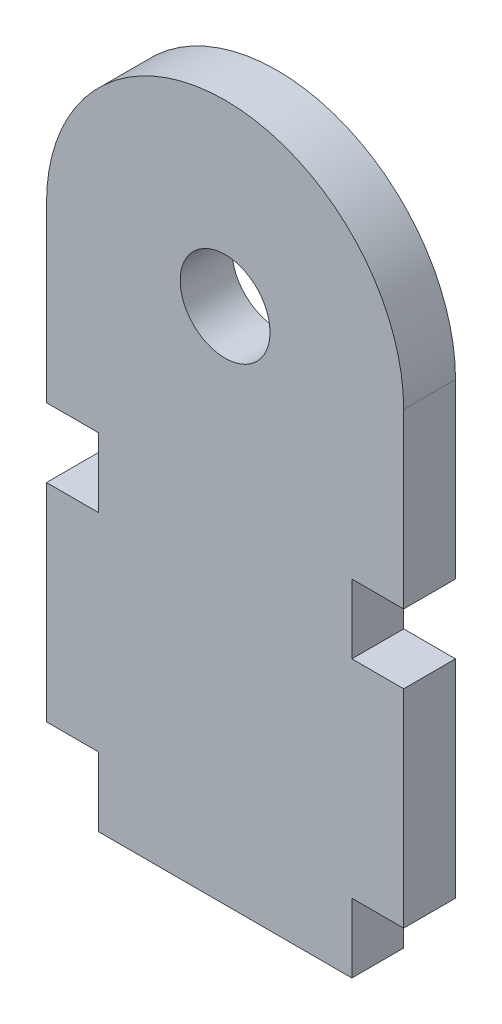
ISO-10303-21;
HEADER;
FILE_DESCRIPTION(('STEP AP214'),'2;1');
FILE_NAME('part.step','',(''),(''),'','','');
FILE_SCHEMA(('AUTOMOTIVE_DESIGN { 1 0 10303 214 1 1 1 1 }'));
ENDSEC;
DATA;
#1=APPLICATION_CONTEXT('core data for automotive mechanical design processes');
#2=APPLICATION_PROTOCOL_DEFINITION('international standard','automotive_design',2000,#1);
#3=PRODUCT_CONTEXT('',#1,'mechanical');
#4=PRODUCT('Part','Part','',(#3));
#5=PRODUCT_RELATED_PRODUCT_CATEGORY('part','',(#4));
#6=PRODUCT_DEFINITION_FORMATION('','',#4);
#7=PRODUCT_DEFINITION_CONTEXT('part definition',#1,'design');
#8=PRODUCT_DEFINITION('design','',#6,#7);
#9=PRODUCT_DEFINITION_SHAPE('','',#8);
#10=(LENGTH_UNIT() NAMED_UNIT(*) SI_UNIT(.MILLI.,.METRE.));
#11=(NAMED_UNIT(*) PLANE_ANGLE_UNIT() SI_UNIT($,.RADIAN.));
#12=(NAMED_UNIT(*) SI_UNIT($,.STERADIAN.) SOLID_ANGLE_UNIT());
#13=UNCERTAINTY_MEASURE_WITH_UNIT(LENGTH_MEASURE(1.E-05),#10,'distance_accuracy_value','');
#14=(GEOMETRIC_REPRESENTATION_CONTEXT(3) GLOBAL_UNCERTAINTY_ASSIGNED_CONTEXT((#13)) GLOBAL_UNIT_ASSIGNED_CONTEXT((#10,
#11,#12)) REPRESENTATION_CONTEXT('',''));
#15=CARTESIAN_POINT('',(0.,0.,0.));
#16=DIRECTION('',(0.,0.,1.));
#17=DIRECTION('',(1.,0.,0.));
#18=AXIS2_PLACEMENT_3D('',#15,#16,#17);
#19=CARTESIAN_POINT('',(8.83499999999999,75.,15.));
#20=DIRECTION('',(0.,0.,1.));
#21=DIRECTION('',(1.,0.,0.));
#22=AXIS2_PLACEMENT_3D('',#19,#20,#21);
#23=PLANE('',#22);
#24=DIRECTION('',(0.,1.,0.));
#25=VECTOR('',#24,1.);
#26=CARTESIAN_POINT('',(60.53,-55.,15.));
#27=LINE('',#26,#25);
#28=CARTESIAN_POINT('',(60.53,-55.,15.));
#29=VERTEX_POINT('',#28);
#30=CARTESIAN_POINT('',(60.53,5.00000000000003,15.));
#31=VERTEX_POINT('',#30);
#32=EDGE_CURVE('E270',#29,#31,#27,.T.);
#33=ORIENTED_EDGE('',*,*,#32,.T.);
#34=DIRECTION('',(-1.,0.,0.));
#35=VECTOR('',#34,1.);
#36=CARTESIAN_POINT('',(60.53,5.00000000000003,15.));
#37=LINE('',#36,#35);
#38=CARTESIAN_POINT('',(45.53,5.00000000000003,15.));
#39=VERTEX_POINT('',#38);
#40=EDGE_CURVE('E162',#31,#39,#37,.T.);
#41=ORIENTED_EDGE('',*,*,#40,.T.);
#42=DIRECTION('',(0.,1.,0.));
#43=VECTOR('',#42,1.);
#44=CARTESIAN_POINT('',(45.53,5.00000000000003,15.));
#45=LINE('',#44,#43);
#46=CARTESIAN_POINT('',(45.53,25.,15.));
#47=VERTEX_POINT('',#46);
#48=EDGE_CURVE('E301',#39,#47,#45,.T.);
#49=ORIENTED_EDGE('',*,*,#48,.T.);
#50=DIRECTION('',(-1.,0.,0.));
#51=VECTOR('',#50,1.);
#52=CARTESIAN_POINT('',(60.53,25.,15.));
#53=LINE('',#52,#51);
#54=CARTESIAN_POINT('',(60.53,25.,15.));
#55=VERTEX_POINT('',#54);
#56=EDGE_CURVE('E313',#55,#47,#53,.T.);
#57=ORIENTED_EDGE('',*,*,#56,.F.);
#58=DIRECTION('',(0.,1.,0.));
#59=VECTOR('',#58,1.);
#60=CARTESIAN_POINT('',(60.53,25.,15.));
#61=LINE('',#60,#59);
#62=CARTESIAN_POINT('',(60.53,75.,15.));
#63=VERTEX_POINT('',#62);
#64=EDGE_CURVE('E314',#55,#63,#61,.T.);
#65=ORIENTED_EDGE('',*,*,#64,.T.);
#66=CARTESIAN_POINT('',(8.83499999999999,75.,15.));
#67=DIRECTION('',(0.,0.,1.));
#68=DIRECTION('',(1.,0.,0.));
#69=AXIS2_PLACEMENT_3D('',#66,#67,#68);
#70=CIRCLE('',#69,51.695);
#71=CARTESIAN_POINT('',(-42.86,75.,15.));
#72=VERTEX_POINT('',#71);
#73=EDGE_CURVE('E316',#63,#72,#70,.T.);
#74=ORIENTED_EDGE('',*,*,#73,.T.);
#75=DIRECTION('',(0.,1.,0.));
#76=VECTOR('',#75,1.);
#77=CARTESIAN_POINT('',(-42.86,25.,15.));
#78=LINE('',#77,#76);
#79=CARTESIAN_POINT('',(-42.86,25.,15.));
#80=VERTEX_POINT('',#79);
#81=EDGE_CURVE('E322',#80,#72,#78,.T.);
#82=ORIENTED_EDGE('',*,*,#81,.F.);
#83=DIRECTION('',(1.,0.,0.));
#84=VECTOR('',#83,1.);
#85=CARTESIAN_POINT('',(-42.86,25.,15.));
#86=LINE('',#85,#84);
#87=CARTESIAN_POINT('',(-27.86,25.,15.));
#88=VERTEX_POINT('',#87);
#89=EDGE_CURVE('E325',#80,#88,#86,.T.);
#90=ORIENTED_EDGE('',*,*,#89,.T.);
#91=DIRECTION('',(0.,1.,0.));
#92=VECTOR('',#91,1.);
#93=CARTESIAN_POINT('',(-27.86,5.00000000000001,15.));
#94=LINE('',#93,#92);
#95=CARTESIAN_POINT('',(-27.86,5.00000000000001,15.));
#96=VERTEX_POINT('',#95);
#97=EDGE_CURVE('E327',#96,#88,#94,.T.);
#98=ORIENTED_EDGE('',*,*,#97,.F.);
#99=DIRECTION('',(1.,0.,0.));
#100=VECTOR('',#99,1.);
#101=CARTESIAN_POINT('',(-42.86,5.00000000000002,15.));
#102=LINE('',#101,#100);
#103=CARTESIAN_POINT('',(-42.86,5.00000000000002,15.));
#104=VERTEX_POINT('',#103);
#105=EDGE_CURVE('E330',#104,#96,#102,.T.);
#106=ORIENTED_EDGE('',*,*,#105,.F.);
#107=DIRECTION('',(0.,1.,0.));
#108=VECTOR('',#107,1.);
#109=CARTESIAN_POINT('',(-42.86,-55.,15.));
#110=LINE('',#109,#108);
#111=CARTESIAN_POINT('',(-42.86,-55.,15.));
#112=VERTEX_POINT('',#111);
#113=EDGE_CURVE('E333',#112,#104,#110,.T.);
#114=ORIENTED_EDGE('',*,*,#113,.F.);
#115=DIRECTION('',(1.,0.,0.));
#116=VECTOR('',#115,1.);
#117=CARTESIAN_POINT('',(-42.86,-55.,15.));
#118=LINE('',#117,#116);
#119=CARTESIAN_POINT('',(-27.86,-55.,15.));
#120=VERTEX_POINT('',#119);
#121=EDGE_CURVE('E336',#112,#120,#118,.T.);
#122=ORIENTED_EDGE('',*,*,#121,.T.);
#123=DIRECTION('',(0.,-1.,0.));
#124=VECTOR('',#123,1.);
#125=CARTESIAN_POINT('',(-27.86,-55.,15.));
#126=LINE('',#125,#124);
#127=CARTESIAN_POINT('',(-27.86,-75.,15.));
#128=VERTEX_POINT('',#127);
#129=EDGE_CURVE('E209',#120,#128,#126,.T.);
#130=ORIENTED_EDGE('',*,*,#129,.T.);
#131=DIRECTION('',(1.,0.,0.));
#132=VECTOR('',#131,1.);
#133=CARTESIAN_POINT('',(-27.86,-75.,15.));
#134=LINE('',#133,#132);
#135=CARTESIAN_POINT('',(45.53,-75.,15.));
#136=VERTEX_POINT('',#135);
#137=EDGE_CURVE('E202',#128,#136,#134,.T.);
#138=ORIENTED_EDGE('',*,*,#137,.T.);
#139=DIRECTION('',(0.,-1.,0.));
#140=VECTOR('',#139,1.);
#141=CARTESIAN_POINT('',(45.53,-55.,15.));
#142=LINE('',#141,#140);
#143=CARTESIAN_POINT('',(45.53,-55.,15.));
#144=VERTEX_POINT('',#143);
#145=EDGE_CURVE('E207',#144,#136,#142,.T.);
#146=ORIENTED_EDGE('',*,*,#145,.F.);
#147=DIRECTION('',(-1.,0.,0.));
#148=VECTOR('',#147,1.);
#149=CARTESIAN_POINT('',(60.53,-55.,15.));
#150=LINE('',#149,#148);
#151=EDGE_CURVE('E224',#29,#144,#150,.T.);
#152=ORIENTED_EDGE('',*,*,#151,.F.);
#153=EDGE_LOOP('',(#33,#41,#49,#57,#65,#74,#82,#90,#98,#106,#114,#122,#130,#138,#146,#152));
#154=FACE_BOUND('',#153,.T.);
#155=CARTESIAN_POINT('',(8.83499999999999,75.,15.));
#156=DIRECTION('',(0.,0.,1.));
#157=DIRECTION('',(1.,0.,0.));
#158=AXIS2_PLACEMENT_3D('',#155,#156,#157);
#159=CIRCLE('',#158,13.);
#160=CARTESIAN_POINT('',(21.835,75.,15.));
#161=VERTEX_POINT('',#160);
#162=EDGE_CURVE('E232',#161,#161,#159,.T.);
#163=ORIENTED_EDGE('',*,*,#162,.F.);
#164=EDGE_LOOP('',(#163));
#165=FACE_BOUND('',#164,.T.);
#166=ADVANCED_FACE('F83',(#154,#165),#23,.T.);
#167=CARTESIAN_POINT('',(8.83499999999999,75.,0.));
#168=DIRECTION('',(0.,0.,1.));
#169=DIRECTION('',(1.,0.,0.));
#170=AXIS2_PLACEMENT_3D('',#167,#168,#169);
#171=PLANE('',#170);
#172=DIRECTION('',(0.,1.,0.));
#173=VECTOR('',#172,1.);
#174=CARTESIAN_POINT('',(60.53,-55.,0.));
#175=LINE('',#174,#173);
#176=CARTESIAN_POINT('',(60.53,-55.,0.));
#177=VERTEX_POINT('',#176);
#178=CARTESIAN_POINT('',(60.53,5.00000000000003,0.));
#179=VERTEX_POINT('',#178);
#180=EDGE_CURVE('E229',#177,#179,#175,.T.);
#181=ORIENTED_EDGE('',*,*,#180,.F.);
#182=DIRECTION('',(-1.,0.,0.));
#183=VECTOR('',#182,1.);
#184=CARTESIAN_POINT('',(60.53,-55.,0.));
#185=LINE('',#184,#183);
#186=CARTESIAN_POINT('',(45.53,-55.,0.));
#187=VERTEX_POINT('',#186);
#188=EDGE_CURVE('E267',#177,#187,#185,.T.);
#189=ORIENTED_EDGE('',*,*,#188,.T.);
#190=DIRECTION('',(0.,-1.,0.));
#191=VECTOR('',#190,1.);
#192=CARTESIAN_POINT('',(45.53,-55.,0.));
#193=LINE('',#192,#191);
#194=CARTESIAN_POINT('',(45.53,-75.,0.));
#195=VERTEX_POINT('',#194);
#196=EDGE_CURVE('E265',#187,#195,#193,.T.);
#197=ORIENTED_EDGE('',*,*,#196,.T.);
#198=DIRECTION('',(1.,0.,0.));
#199=VECTOR('',#198,1.);
#200=CARTESIAN_POINT('',(-27.86,-75.,0.));
#201=LINE('',#200,#199);
#202=CARTESIAN_POINT('',(-27.86,-75.,0.));
#203=VERTEX_POINT('',#202);
#204=EDGE_CURVE('E218',#203,#195,#201,.T.);
#205=ORIENTED_EDGE('',*,*,#204,.F.);
#206=DIRECTION('',(0.,-1.,0.));
#207=VECTOR('',#206,1.);
#208=CARTESIAN_POINT('',(-27.86,-55.,0.));
#209=LINE('',#208,#207);
#210=CARTESIAN_POINT('',(-27.86,-55.,0.));
#211=VERTEX_POINT('',#210);
#212=EDGE_CURVE('E262',#211,#203,#209,.T.);
#213=ORIENTED_EDGE('',*,*,#212,.F.);
#214=DIRECTION('',(1.,0.,0.));
#215=VECTOR('',#214,1.);
#216=CARTESIAN_POINT('',(-42.86,-55.,0.));
#217=LINE('',#216,#215);
#218=CARTESIAN_POINT('',(-42.86,-55.,0.));
#219=VERTEX_POINT('',#218);
#220=EDGE_CURVE('E260',#219,#211,#217,.T.);
#221=ORIENTED_EDGE('',*,*,#220,.F.);
#222=DIRECTION('',(0.,1.,0.));
#223=VECTOR('',#222,1.);
#224=CARTESIAN_POINT('',(-42.86,-55.,0.));
#225=LINE('',#224,#223);
#226=CARTESIAN_POINT('',(-42.86,5.00000000000002,0.));
#227=VERTEX_POINT('',#226);
#228=EDGE_CURVE('E257',#219,#227,#225,.T.);
#229=ORIENTED_EDGE('',*,*,#228,.T.);
#230=DIRECTION('',(1.,0.,0.));
#231=VECTOR('',#230,1.);
#232=CARTESIAN_POINT('',(-42.86,5.00000000000002,0.));
#233=LINE('',#232,#231);
#234=CARTESIAN_POINT('',(-27.86,5.00000000000001,0.));
#235=VERTEX_POINT('',#234);
#236=EDGE_CURVE('E254',#227,#235,#233,.T.);
#237=ORIENTED_EDGE('',*,*,#236,.T.);
#238=DIRECTION('',(0.,1.,0.));
#239=VECTOR('',#238,1.);
#240=CARTESIAN_POINT('',(-27.86,5.00000000000001,0.));
#241=LINE('',#240,#239);
#242=CARTESIAN_POINT('',(-27.86,25.,0.));
#243=VERTEX_POINT('',#242);
#244=EDGE_CURVE('E251',#235,#243,#241,.T.);
#245=ORIENTED_EDGE('',*,*,#244,.T.);
#246=DIRECTION('',(1.,0.,0.));
#247=VECTOR('',#246,1.);
#248=CARTESIAN_POINT('',(-42.86,25.,0.));
#249=LINE('',#248,#247);
#250=CARTESIAN_POINT('',(-42.86,25.,0.));
#251=VERTEX_POINT('',#250);
#252=EDGE_CURVE('E248',#251,#243,#249,.T.);
#253=ORIENTED_EDGE('',*,*,#252,.F.);
#254=DIRECTION('',(0.,1.,0.));
#255=VECTOR('',#254,1.);
#256=CARTESIAN_POINT('',(-42.86,25.,0.));
#257=LINE('',#256,#255);
#258=CARTESIAN_POINT('',(-42.86,75.,0.));
#259=VERTEX_POINT('',#258);
#260=EDGE_CURVE('E245',#251,#259,#257,.T.);
#261=ORIENTED_EDGE('',*,*,#260,.T.);
#262=CARTESIAN_POINT('',(8.83499999999999,75.,0.));
#263=DIRECTION('',(0.,0.,1.));
#264=DIRECTION('',(1.,0.,0.));
#265=AXIS2_PLACEMENT_3D('',#262,#263,#264);
#266=CIRCLE('',#265,51.695);
#267=CARTESIAN_POINT('',(60.53,75.,0.));
#268=VERTEX_POINT('',#267);
#269=EDGE_CURVE('E242',#268,#259,#266,.T.);
#270=ORIENTED_EDGE('',*,*,#269,.F.);
#271=DIRECTION('',(0.,1.,0.));
#272=VECTOR('',#271,1.);
#273=CARTESIAN_POINT('',(60.53,25.,0.));
#274=LINE('',#273,#272);
#275=CARTESIAN_POINT('',(60.53,25.,0.));
#276=VERTEX_POINT('',#275);
#277=EDGE_CURVE('E240',#276,#268,#274,.T.);
#278=ORIENTED_EDGE('',*,*,#277,.F.);
#279=DIRECTION('',(-1.,0.,0.));
#280=VECTOR('',#279,1.);
#281=CARTESIAN_POINT('',(60.53,25.,0.));
#282=LINE('',#281,#280);
#283=CARTESIAN_POINT('',(45.53,25.,0.));
#284=VERTEX_POINT('',#283);
#285=EDGE_CURVE('E237',#276,#284,#282,.T.);
#286=ORIENTED_EDGE('',*,*,#285,.T.);
#287=DIRECTION('',(0.,1.,0.));
#288=VECTOR('',#287,1.);
#289=CARTESIAN_POINT('',(45.53,5.00000000000003,0.));
#290=LINE('',#289,#288);
#291=CARTESIAN_POINT('',(45.53,5.00000000000003,0.));
#292=VERTEX_POINT('',#291);
#293=EDGE_CURVE('E234',#292,#284,#290,.T.);
#294=ORIENTED_EDGE('',*,*,#293,.F.);
#295=DIRECTION('',(-1.,0.,0.));
#296=VECTOR('',#295,1.);
#297=CARTESIAN_POINT('',(60.53,5.00000000000003,0.));
#298=LINE('',#297,#296);
#299=EDGE_CURVE('E231',#179,#292,#298,.T.);
#300=ORIENTED_EDGE('',*,*,#299,.F.);
#301=EDGE_LOOP('',(#181,#189,#197,#205,#213,#221,#229,#237,#245,#253,#261,#270,#278,#286,#294,#300));
#302=FACE_BOUND('',#301,.T.);
#303=CARTESIAN_POINT('',(8.83499999999999,75.,0.));
#304=DIRECTION('',(0.,0.,1.));
#305=DIRECTION('',(1.,0.,0.));
#306=AXIS2_PLACEMENT_3D('',#303,#304,#305);
#307=CIRCLE('',#306,13.);
#308=CARTESIAN_POINT('',(21.835,75.,0.));
#309=VERTEX_POINT('',#308);
#310=EDGE_CURVE('E374',#309,#309,#307,.T.);
#311=ORIENTED_EDGE('',*,*,#310,.T.);
#312=EDGE_LOOP('',(#311));
#313=FACE_BOUND('',#312,.T.);
#314=ADVANCED_FACE('F303',(#302,#313),#171,.F.);
#315=CARTESIAN_POINT('',(60.53,-55.,15.));
#316=DIRECTION('',(-1.,0.,0.));
#317=DIRECTION('',(0.,-1.,0.));
#318=AXIS2_PLACEMENT_3D('',#315,#316,#317);
#319=PLANE('',#318);
#320=ORIENTED_EDGE('',*,*,#180,.T.);
#321=DIRECTION('',(0.,0.,-1.));
#322=VECTOR('',#321,1.);
#323=CARTESIAN_POINT('',(60.53,5.00000000000003,15.));
#324=LINE('',#323,#322);
#325=EDGE_CURVE('E12',#31,#179,#324,.T.);
#326=ORIENTED_EDGE('',*,*,#325,.F.);
#327=ORIENTED_EDGE('',*,*,#32,.F.);
#328=DIRECTION('',(0.,0.,-1.));
#329=VECTOR('',#328,1.);
#330=CARTESIAN_POINT('',(60.53,-55.,15.));
#331=LINE('',#330,#329);
#332=EDGE_CURVE('E100',#29,#177,#331,.T.);
#333=ORIENTED_EDGE('',*,*,#332,.T.);
#334=EDGE_LOOP('',(#320,#326,#327,#333));
#335=FACE_BOUND('',#334,.T.);
#336=ADVANCED_FACE('F85',(#335),#319,.F.);
#337=CARTESIAN_POINT('',(60.53,5.00000000000003,15.));
#338=DIRECTION('',(0.,-1.,0.));
#339=DIRECTION('',(0.,0.,-1.));
#340=AXIS2_PLACEMENT_3D('',#337,#338,#339);
#341=PLANE('',#340);
#342=ORIENTED_EDGE('',*,*,#299,.T.);
#343=DIRECTION('',(0.,0.,-1.));
#344=VECTOR('',#343,1.);
#345=CARTESIAN_POINT('',(45.53,5.00000000000003,15.));
#346=LINE('',#345,#344);
#347=EDGE_CURVE('E92',#39,#292,#346,.T.);
#348=ORIENTED_EDGE('',*,*,#347,.F.);
#349=ORIENTED_EDGE('',*,*,#40,.F.);
#350=ORIENTED_EDGE('',*,*,#325,.T.);
#351=EDGE_LOOP('',(#342,#348,#349,#350));
#352=FACE_BOUND('',#351,.T.);
#353=ADVANCED_FACE('F367',(#352),#341,.F.);
#354=CARTESIAN_POINT('',(45.53,5.00000000000003,15.));
#355=DIRECTION('',(-1.,0.,0.));
#356=DIRECTION('',(0.,-1.,0.));
#357=AXIS2_PLACEMENT_3D('',#354,#355,#356);
#358=PLANE('',#357);
#359=ORIENTED_EDGE('',*,*,#293,.T.);
#360=DIRECTION('',(0.,0.,-1.));
#361=VECTOR('',#360,1.);
#362=CARTESIAN_POINT('',(45.53,25.,15.));
#363=LINE('',#362,#361);
#364=EDGE_CURVE('E294',#47,#284,#363,.T.);
#365=ORIENTED_EDGE('',*,*,#364,.F.);
#366=ORIENTED_EDGE('',*,*,#48,.F.);
#367=ORIENTED_EDGE('',*,*,#347,.T.);
#368=EDGE_LOOP('',(#359,#365,#366,#367));
#369=FACE_BOUND('',#368,.T.);
#370=ADVANCED_FACE('F299',(#369),#358,.F.);
#371=CARTESIAN_POINT('',(60.53,25.,15.));
#372=DIRECTION('',(0.,-1.,0.));
#373=DIRECTION('',(1.,0.,0.));
#374=AXIS2_PLACEMENT_3D('',#371,#372,#373);
#375=PLANE('',#374);
#376=ORIENTED_EDGE('',*,*,#285,.F.);
#377=DIRECTION('',(0.,0.,-1.));
#378=VECTOR('',#377,1.);
#379=CARTESIAN_POINT('',(60.53,25.,15.));
#380=LINE('',#379,#378);
#381=EDGE_CURVE('E292',#55,#276,#380,.T.);
#382=ORIENTED_EDGE('',*,*,#381,.F.);
#383=ORIENTED_EDGE('',*,*,#56,.T.);
#384=ORIENTED_EDGE('',*,*,#364,.T.);
#385=EDGE_LOOP('',(#376,#382,#383,#384));
#386=FACE_BOUND('',#385,.T.);
#387=ADVANCED_FACE('F309',(#386),#375,.T.);
#388=CARTESIAN_POINT('',(60.53,25.,15.));
#389=DIRECTION('',(-1.,0.,0.));
#390=DIRECTION('',(0.,-1.,0.));
#391=AXIS2_PLACEMENT_3D('',#388,#389,#390);
#392=PLANE('',#391);
#393=ORIENTED_EDGE('',*,*,#277,.T.);
#394=DIRECTION('',(0.,0.,-1.));
#395=VECTOR('',#394,1.);
#396=CARTESIAN_POINT('',(60.53,75.,15.));
#397=LINE('',#396,#395);
#398=EDGE_CURVE('E289',#63,#268,#397,.T.);
#399=ORIENTED_EDGE('',*,*,#398,.F.);
#400=ORIENTED_EDGE('',*,*,#64,.F.);
#401=ORIENTED_EDGE('',*,*,#381,.T.);
#402=EDGE_LOOP('',(#393,#399,#400,#401));
#403=FACE_BOUND('',#402,.T.);
#404=ADVANCED_FACE('F388',(#403),#392,.F.);
#405=CARTESIAN_POINT('',(8.83499999999999,75.,15.));
#406=DIRECTION('',(0.,0.,-1.));
#407=DIRECTION('',(-1.,0.,0.));
#408=AXIS2_PLACEMENT_3D('',#405,#406,#407);
#409=CYLINDRICAL_SURFACE('',#408,51.695);
#410=ORIENTED_EDGE('',*,*,#269,.T.);
#411=DIRECTION('',(0.,0.,-1.));
#412=VECTOR('',#411,1.);
#413=CARTESIAN_POINT('',(-42.86,75.,15.));
#414=LINE('',#413,#412);
#415=EDGE_CURVE('E287',#72,#259,#414,.T.);
#416=ORIENTED_EDGE('',*,*,#415,.F.);
#417=ORIENTED_EDGE('',*,*,#73,.F.);
#418=ORIENTED_EDGE('',*,*,#398,.T.);
#419=EDGE_LOOP('',(#410,#416,#417,#418));
#420=FACE_BOUND('',#419,.T.);
#421=ADVANCED_FACE('F391',(#420),#409,.T.);
#422=CARTESIAN_POINT('',(-42.86,25.,15.));
#423=DIRECTION('',(-1.,0.,0.));
#424=DIRECTION('',(0.,0.,1.));
#425=AXIS2_PLACEMENT_3D('',#422,#423,#424);
#426=PLANE('',#425);
#427=ORIENTED_EDGE('',*,*,#260,.F.);
#428=DIRECTION('',(0.,0.,-1.));
#429=VECTOR('',#428,1.);
#430=CARTESIAN_POINT('',(-42.86,25.,15.));
#431=LINE('',#430,#429);
#432=EDGE_CURVE('E285',#80,#251,#431,.T.);
#433=ORIENTED_EDGE('',*,*,#432,.F.);
#434=ORIENTED_EDGE('',*,*,#81,.T.);
#435=ORIENTED_EDGE('',*,*,#415,.T.);
#436=EDGE_LOOP('',(#427,#433,#434,#435));
#437=FACE_BOUND('',#436,.T.);
#438=ADVANCED_FACE('F395',(#437),#426,.T.);
#439=CARTESIAN_POINT('',(-42.86,25.,15.));
#440=DIRECTION('',(0.,1.,0.));
#441=DIRECTION('',(-1.,0.,0.));
#442=AXIS2_PLACEMENT_3D('',#439,#440,#441);
#443=PLANE('',#442);
#444=ORIENTED_EDGE('',*,*,#252,.T.);
#445=DIRECTION('',(0.,0.,-1.));
#446=VECTOR('',#445,1.);
#447=CARTESIAN_POINT('',(-27.86,25.,15.));
#448=LINE('',#447,#446);
#449=EDGE_CURVE('E283',#88,#243,#448,.T.);
#450=ORIENTED_EDGE('',*,*,#449,.F.);
#451=ORIENTED_EDGE('',*,*,#89,.F.);
#452=ORIENTED_EDGE('',*,*,#432,.T.);
#453=EDGE_LOOP('',(#444,#450,#451,#452));
#454=FACE_BOUND('',#453,.T.);
#455=ADVANCED_FACE('F399',(#454),#443,.F.);
#456=CARTESIAN_POINT('',(-27.86,5.00000000000001,15.));
#457=DIRECTION('',(-1.,0.,0.));
#458=DIRECTION('',(0.,-1.,0.));
#459=AXIS2_PLACEMENT_3D('',#456,#457,#458);
#460=PLANE('',#459);
#461=ORIENTED_EDGE('',*,*,#244,.F.);
#462=DIRECTION('',(0.,0.,-1.));
#463=VECTOR('',#462,1.);
#464=CARTESIAN_POINT('',(-27.86,5.00000000000001,15.));
#465=LINE('',#464,#463);
#466=EDGE_CURVE('E281',#96,#235,#465,.T.);
#467=ORIENTED_EDGE('',*,*,#466,.F.);
#468=ORIENTED_EDGE('',*,*,#97,.T.);
#469=ORIENTED_EDGE('',*,*,#449,.T.);
#470=EDGE_LOOP('',(#461,#467,#468,#469));
#471=FACE_BOUND('',#470,.T.);
#472=ADVANCED_FACE('F403',(#471),#460,.T.);
#473=CARTESIAN_POINT('',(-42.86,5.00000000000002,15.));
#474=DIRECTION('',(0.,1.,0.));
#475=DIRECTION('',(-1.,0.,0.));
#476=AXIS2_PLACEMENT_3D('',#473,#474,#475);
#477=PLANE('',#476);
#478=ORIENTED_EDGE('',*,*,#236,.F.);
#479=DIRECTION('',(0.,0.,-1.));
#480=VECTOR('',#479,1.);
#481=CARTESIAN_POINT('',(-42.86,5.00000000000002,15.));
#482=LINE('',#481,#480);
#483=EDGE_CURVE('E279',#104,#227,#482,.T.);
#484=ORIENTED_EDGE('',*,*,#483,.F.);
#485=ORIENTED_EDGE('',*,*,#105,.T.);
#486=ORIENTED_EDGE('',*,*,#466,.T.);
#487=EDGE_LOOP('',(#478,#484,#485,#486));
#488=FACE_BOUND('',#487,.T.);
#489=ADVANCED_FACE('F407',(#488),#477,.T.);
#490=CARTESIAN_POINT('',(-42.86,-55.,15.));
#491=DIRECTION('',(-1.,0.,0.));
#492=DIRECTION('',(0.,0.,1.));
#493=AXIS2_PLACEMENT_3D('',#490,#491,#492);
#494=PLANE('',#493);
#495=ORIENTED_EDGE('',*,*,#228,.F.);
#496=DIRECTION('',(0.,0.,-1.));
#497=VECTOR('',#496,1.);
#498=CARTESIAN_POINT('',(-42.86,-55.,15.));
#499=LINE('',#498,#497);
#500=EDGE_CURVE('E277',#112,#219,#499,.T.);
#501=ORIENTED_EDGE('',*,*,#500,.F.);
#502=ORIENTED_EDGE('',*,*,#113,.T.);
#503=ORIENTED_EDGE('',*,*,#483,.T.);
#504=EDGE_LOOP('',(#495,#501,#502,#503));
#505=FACE_BOUND('',#504,.T.);
#506=ADVANCED_FACE('F411',(#505),#494,.T.);
#507=CARTESIAN_POINT('',(-42.86,-55.,15.));
#508=DIRECTION('',(0.,1.,0.));
#509=DIRECTION('',(0.,0.,1.));
#510=AXIS2_PLACEMENT_3D('',#507,#508,#509);
#511=PLANE('',#510);
#512=ORIENTED_EDGE('',*,*,#220,.T.);
#513=DIRECTION('',(0.,0.,-1.));
#514=VECTOR('',#513,1.);
#515=CARTESIAN_POINT('',(-27.86,-55.,15.));
#516=LINE('',#515,#514);
#517=EDGE_CURVE('E274',#120,#211,#516,.T.);
#518=ORIENTED_EDGE('',*,*,#517,.F.);
#519=ORIENTED_EDGE('',*,*,#121,.F.);
#520=ORIENTED_EDGE('',*,*,#500,.T.);
#521=EDGE_LOOP('',(#512,#518,#519,#520));
#522=FACE_BOUND('',#521,.T.);
#523=ADVANCED_FACE('F342',(#522),#511,.F.);
#524=CARTESIAN_POINT('',(-27.86,-55.,15.));
#525=DIRECTION('',(1.,0.,0.));
#526=DIRECTION('',(0.,1.,0.));
#527=AXIS2_PLACEMENT_3D('',#524,#525,#526);
#528=PLANE('',#527);
#529=ORIENTED_EDGE('',*,*,#212,.T.);
#530=DIRECTION('',(0.,0.,-1.));
#531=VECTOR('',#530,1.);
#532=CARTESIAN_POINT('',(-27.86,-75.,15.));
#533=LINE('',#532,#531);
#534=EDGE_CURVE('E221',#128,#203,#533,.T.);
#535=ORIENTED_EDGE('',*,*,#534,.F.);
#536=ORIENTED_EDGE('',*,*,#129,.F.);
#537=ORIENTED_EDGE('',*,*,#517,.T.);
#538=EDGE_LOOP('',(#529,#535,#536,#537));
#539=FACE_BOUND('',#538,.T.);
#540=ADVANCED_FACE('F346',(#539),#528,.F.);
#541=CARTESIAN_POINT('',(-27.86,-75.,15.));
#542=DIRECTION('',(0.,1.,0.));
#543=DIRECTION('',(-1.,0.,0.));
#544=AXIS2_PLACEMENT_3D('',#541,#542,#543);
#545=PLANE('',#544);
#546=ORIENTED_EDGE('',*,*,#204,.T.);
#547=DIRECTION('',(0.,0.,-1.));
#548=VECTOR('',#547,1.);
#549=CARTESIAN_POINT('',(45.53,-75.,15.));
#550=LINE('',#549,#548);
#551=EDGE_CURVE('E215',#136,#195,#550,.T.);
#552=ORIENTED_EDGE('',*,*,#551,.F.);
#553=ORIENTED_EDGE('',*,*,#137,.F.);
#554=ORIENTED_EDGE('',*,*,#534,.T.);
#555=EDGE_LOOP('',(#546,#552,#553,#554));
#556=FACE_BOUND('',#555,.T.);
#557=ADVANCED_FACE('F216',(#556),#545,.F.);
#558=CARTESIAN_POINT('',(45.53,-55.,15.));
#559=DIRECTION('',(1.,0.,0.));
#560=DIRECTION('',(0.,0.,-1.));
#561=AXIS2_PLACEMENT_3D('',#558,#559,#560);
#562=PLANE('',#561);
#563=ORIENTED_EDGE('',*,*,#196,.F.);
#564=DIRECTION('',(0.,0.,-1.));
#565=VECTOR('',#564,1.);
#566=CARTESIAN_POINT('',(45.53,-55.,15.));
#567=LINE('',#566,#565);
#568=EDGE_CURVE('E150',#144,#187,#567,.T.);
#569=ORIENTED_EDGE('',*,*,#568,.F.);
#570=ORIENTED_EDGE('',*,*,#145,.T.);
#571=ORIENTED_EDGE('',*,*,#551,.T.);
#572=EDGE_LOOP('',(#563,#569,#570,#571));
#573=FACE_BOUND('',#572,.T.);
#574=ADVANCED_FACE('F223',(#573),#562,.T.);
#575=CARTESIAN_POINT('',(60.53,-55.,15.));
#576=DIRECTION('',(0.,-1.,0.));
#577=DIRECTION('',(1.,0.,0.));
#578=AXIS2_PLACEMENT_3D('',#575,#576,#577);
#579=PLANE('',#578);
#580=ORIENTED_EDGE('',*,*,#188,.F.);
#581=ORIENTED_EDGE('',*,*,#332,.F.);
#582=ORIENTED_EDGE('',*,*,#151,.T.);
#583=ORIENTED_EDGE('',*,*,#568,.T.);
#584=EDGE_LOOP('',(#580,#581,#582,#583));
#585=FACE_BOUND('',#584,.T.);
#586=ADVANCED_FACE('F347',(#585),#579,.T.);
#587=CARTESIAN_POINT('',(8.83499999999999,75.,15.));
#588=DIRECTION('',(0.,0.,-1.));
#589=DIRECTION('',(-1.,0.,0.));
#590=AXIS2_PLACEMENT_3D('',#587,#588,#589);
#591=CYLINDRICAL_SURFACE('',#590,13.);
#592=ORIENTED_EDGE('',*,*,#162,.T.);
#593=EDGE_LOOP('',(#592));
#594=FACE_BOUND('',#593,.T.);
#595=ORIENTED_EDGE('',*,*,#310,.F.);
#596=EDGE_LOOP('',(#595));
#597=FACE_BOUND('',#596,.T.);
#598=ADVANCED_FACE('F349',(#594,#597),#591,.F.);
#599=CLOSED_SHELL('',(#166,#314,#336,#353,#370,#387,#404,#421,#438,#455,#472,#489,#506,#523,
#540,#557,#574,#586,#598));
#600=MANIFOLD_SOLID_BREP('B2',#599);
#601=ADVANCED_BREP_SHAPE_REPRESENTATION('',(#18,#600),#14);
#602=SHAPE_DEFINITION_REPRESENTATION(#9,#601);
ENDSEC;
END-ISO-10303-21;
